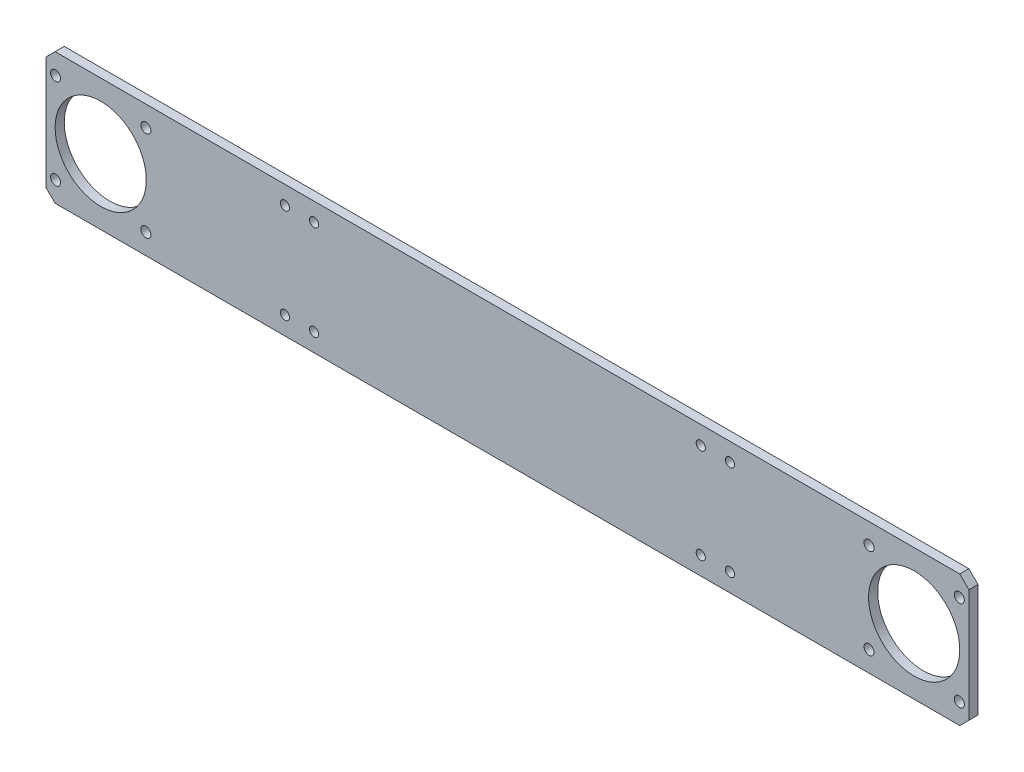
ISO-10303-21;
HEADER;
FILE_DESCRIPTION(('STEP AP214'),'2;1');
FILE_NAME('part.step','',(''),(''),'','','');
FILE_SCHEMA(('AUTOMOTIVE_DESIGN { 1 0 10303 214 1 1 1 1 }'));
ENDSEC;
DATA;
#1=APPLICATION_CONTEXT('core data for automotive mechanical design processes');
#2=APPLICATION_PROTOCOL_DEFINITION('international standard','automotive_design',2000,#1);
#3=PRODUCT_CONTEXT('',#1,'mechanical');
#4=PRODUCT('Part','Part','',(#3));
#5=PRODUCT_RELATED_PRODUCT_CATEGORY('part','',(#4));
#6=PRODUCT_DEFINITION_FORMATION('','',#4);
#7=PRODUCT_DEFINITION_CONTEXT('part definition',#1,'design');
#8=PRODUCT_DEFINITION('design','',#6,#7);
#9=PRODUCT_DEFINITION_SHAPE('','',#8);
#10=(LENGTH_UNIT() NAMED_UNIT(*) SI_UNIT(.MILLI.,.METRE.));
#11=(NAMED_UNIT(*) PLANE_ANGLE_UNIT() SI_UNIT($,.RADIAN.));
#12=(NAMED_UNIT(*) SI_UNIT($,.STERADIAN.) SOLID_ANGLE_UNIT());
#13=UNCERTAINTY_MEASURE_WITH_UNIT(LENGTH_MEASURE(1.E-05),#10,'distance_accuracy_value','');
#14=(GEOMETRIC_REPRESENTATION_CONTEXT(3) GLOBAL_UNCERTAINTY_ASSIGNED_CONTEXT((#13)) GLOBAL_UNIT_ASSIGNED_CONTEXT((#10,
#11,#12)) REPRESENTATION_CONTEXT('',''));
#15=CARTESIAN_POINT('',(0.,0.,0.));
#16=DIRECTION('',(0.,0.,1.));
#17=DIRECTION('',(1.,0.,0.));
#18=AXIS2_PLACEMENT_3D('',#15,#16,#17);
#19=CARTESIAN_POINT('',(0.,0.,5.));
#20=DIRECTION('',(0.,0.,-1.));
#21=DIRECTION('',(-1.,0.,0.));
#22=AXIS2_PLACEMENT_3D('',#19,#20,#21);
#23=PLANE('',#22);
#24=CARTESIAN_POINT('',(106.,-26.,5.));
#25=DIRECTION('',(0.,0.,1.));
#26=DIRECTION('',(-1.,0.,0.));
#27=AXIS2_PLACEMENT_3D('',#24,#25,#26);
#28=CIRCLE('',#27,2.50000000000001);
#29=CARTESIAN_POINT('',(103.5,-26.,5.));
#30=VERTEX_POINT('',#29);
#31=EDGE_CURVE('E265',#30,#30,#28,.T.);
#32=ORIENTED_EDGE('',*,*,#31,.F.);
#33=EDGE_LOOP('',(#32));
#34=FACE_BOUND('',#33,.T.);
#35=CARTESIAN_POINT('',(-106.,-26.,5.));
#36=DIRECTION('',(0.,0.,1.));
#37=DIRECTION('',(1.,0.,0.));
#38=AXIS2_PLACEMENT_3D('',#35,#36,#37);
#39=CIRCLE('',#38,2.50000000000001);
#40=CARTESIAN_POINT('',(-103.5,-26.,5.));
#41=VERTEX_POINT('',#40);
#42=EDGE_CURVE('E272',#41,#41,#39,.T.);
#43=ORIENTED_EDGE('',*,*,#42,.F.);
#44=EDGE_LOOP('',(#43));
#45=FACE_BOUND('',#44,.T.);
#46=CARTESIAN_POINT('',(-106.,26.,5.));
#47=DIRECTION('',(0.,0.,1.));
#48=DIRECTION('',(1.,0.,0.));
#49=AXIS2_PLACEMENT_3D('',#46,#47,#48);
#50=CIRCLE('',#49,2.50000000000001);
#51=CARTESIAN_POINT('',(-103.5,26.,5.));
#52=VERTEX_POINT('',#51);
#53=EDGE_CURVE('E253',#52,#52,#50,.T.);
#54=ORIENTED_EDGE('',*,*,#53,.F.);
#55=EDGE_LOOP('',(#54));
#56=FACE_BOUND('',#55,.T.);
#57=CARTESIAN_POINT('',(-122.,-26.,5.));
#58=DIRECTION('',(0.,0.,1.));
#59=DIRECTION('',(1.,0.,0.));
#60=AXIS2_PLACEMENT_3D('',#57,#58,#59);
#61=CIRCLE('',#60,2.50000000000001);
#62=CARTESIAN_POINT('',(-119.5,-26.,5.));
#63=VERTEX_POINT('',#62);
#64=EDGE_CURVE('E260',#63,#63,#61,.T.);
#65=ORIENTED_EDGE('',*,*,#64,.F.);
#66=EDGE_LOOP('',(#65));
#67=FACE_BOUND('',#66,.T.);
#68=CARTESIAN_POINT('',(122.,26.,5.));
#69=DIRECTION('',(0.,0.,1.));
#70=DIRECTION('',(-1.,0.,0.));
#71=AXIS2_PLACEMENT_3D('',#68,#69,#70);
#72=CIRCLE('',#71,2.5);
#73=CARTESIAN_POINT('',(119.5,26.,5.));
#74=VERTEX_POINT('',#73);
#75=EDGE_CURVE('E289',#74,#74,#72,.T.);
#76=ORIENTED_EDGE('',*,*,#75,.F.);
#77=EDGE_LOOP('',(#76));
#78=FACE_BOUND('',#77,.T.);
#79=CARTESIAN_POINT('',(122.,-26.,5.));
#80=DIRECTION('',(0.,0.,1.));
#81=DIRECTION('',(-1.,0.,0.));
#82=AXIS2_PLACEMENT_3D('',#79,#80,#81);
#83=CIRCLE('',#82,2.50000000000001);
#84=CARTESIAN_POINT('',(119.5,-26.,5.));
#85=VERTEX_POINT('',#84);
#86=EDGE_CURVE('E277',#85,#85,#83,.T.);
#87=ORIENTED_EDGE('',*,*,#86,.F.);
#88=EDGE_LOOP('',(#87));
#89=FACE_BOUND('',#88,.T.);
#90=CARTESIAN_POINT('',(106.,26.,5.));
#91=DIRECTION('',(0.,0.,1.));
#92=DIRECTION('',(-1.,0.,0.));
#93=AXIS2_PLACEMENT_3D('',#90,#91,#92);
#94=CIRCLE('',#93,2.50000000000001);
#95=CARTESIAN_POINT('',(103.5,26.,5.));
#96=VERTEX_POINT('',#95);
#97=EDGE_CURVE('E284',#96,#96,#94,.T.);
#98=ORIENTED_EDGE('',*,*,#97,.F.);
#99=EDGE_LOOP('',(#98));
#100=FACE_BOUND('',#99,.T.);
#101=CARTESIAN_POINT('',(-122.,26.,5.));
#102=DIRECTION('',(0.,0.,1.));
#103=DIRECTION('',(1.,0.,0.));
#104=AXIS2_PLACEMENT_3D('',#101,#102,#103);
#105=CIRCLE('',#104,2.50000000000001);
#106=CARTESIAN_POINT('',(-119.5,26.,5.));
#107=VERTEX_POINT('',#106);
#108=EDGE_CURVE('E247',#107,#107,#105,.T.);
#109=ORIENTED_EDGE('',*,*,#108,.F.);
#110=EDGE_LOOP('',(#109));
#111=FACE_BOUND('',#110,.T.);
#112=DIRECTION('',(0.,-1.,0.));
#113=VECTOR('',#112,1.);
#114=CARTESIAN_POINT('',(-253.,36.0000000000001,5.));
#115=LINE('',#114,#113);
#116=CARTESIAN_POINT('',(-253.,31.0000000000001,5.));
#117=VERTEX_POINT('',#116);
#118=CARTESIAN_POINT('',(-253.,-30.9999999999999,5.));
#119=VERTEX_POINT('',#118);
#120=EDGE_CURVE('E144',#117,#119,#115,.T.);
#121=ORIENTED_EDGE('',*,*,#120,.T.);
#122=DIRECTION('',(-0.707106781186548,0.707106781186548,0.));
#123=VECTOR('',#122,1.);
#124=CARTESIAN_POINT('',(-248.,-35.9999999999999,5.));
#125=LINE('',#124,#123);
#126=CARTESIAN_POINT('',(-248.,-35.9999999999999,5.));
#127=VERTEX_POINT('',#126);
#128=EDGE_CURVE('E158',#119,#127,#125,.F.);
#129=ORIENTED_EDGE('',*,*,#128,.T.);
#130=DIRECTION('',(1.,0.,0.));
#131=VECTOR('',#130,1.);
#132=CARTESIAN_POINT('',(253.,-35.9999999999999,5.));
#133=LINE('',#132,#131);
#134=CARTESIAN_POINT('',(248.,-35.9999999999999,5.));
#135=VERTEX_POINT('',#134);
#136=EDGE_CURVE('E125',#127,#135,#133,.T.);
#137=ORIENTED_EDGE('',*,*,#136,.T.);
#138=DIRECTION('',(-0.707106781186548,-0.707106781186548,0.));
#139=VECTOR('',#138,1.);
#140=CARTESIAN_POINT('',(253.,-30.9999999999998,5.));
#141=LINE('',#140,#139);
#142=CARTESIAN_POINT('',(253.,-30.9999999999998,5.));
#143=VERTEX_POINT('',#142);
#144=EDGE_CURVE('E154',#135,#143,#141,.F.);
#145=ORIENTED_EDGE('',*,*,#144,.T.);
#146=DIRECTION('',(0.,1.,0.));
#147=VECTOR('',#146,1.);
#148=CARTESIAN_POINT('',(253.,36.0000000000001,5.));
#149=LINE('',#148,#147);
#150=CARTESIAN_POINT('',(253.,31.0000000000001,5.));
#151=VERTEX_POINT('',#150);
#152=EDGE_CURVE('E167',#143,#151,#149,.T.);
#153=ORIENTED_EDGE('',*,*,#152,.T.);
#154=DIRECTION('',(0.707106781186548,-0.707106781186548,0.));
#155=VECTOR('',#154,1.);
#156=CARTESIAN_POINT('',(248.,36.0000000000001,5.));
#157=LINE('',#156,#155);
#158=CARTESIAN_POINT('',(248.,36.0000000000001,5.));
#159=VERTEX_POINT('',#158);
#160=EDGE_CURVE('E60',#151,#159,#157,.F.);
#161=ORIENTED_EDGE('',*,*,#160,.T.);
#162=DIRECTION('',(-1.,0.,0.));
#163=VECTOR('',#162,1.);
#164=CARTESIAN_POINT('',(253.,36.0000000000001,5.));
#165=LINE('',#164,#163);
#166=CARTESIAN_POINT('',(-248.,36.0000000000001,5.));
#167=VERTEX_POINT('',#166);
#168=EDGE_CURVE('E145',#159,#167,#165,.T.);
#169=ORIENTED_EDGE('',*,*,#168,.T.);
#170=DIRECTION('',(0.707106781186551,0.707106781186544,0.));
#171=VECTOR('',#170,1.);
#172=CARTESIAN_POINT('',(-253.,31.0000000000001,5.));
#173=LINE('',#172,#171);
#174=EDGE_CURVE('E156',#167,#117,#173,.F.);
#175=ORIENTED_EDGE('',*,*,#174,.T.);
#176=EDGE_LOOP('',(#121,#129,#137,#145,#153,#161,#169,#175));
#177=FACE_BOUND('',#176,.T.);
#178=CARTESIAN_POINT('',(223.,1.1485678381606E-13,5.));
#179=DIRECTION('',(0.,0.,1.));
#180=DIRECTION('',(1.,0.,0.));
#181=AXIS2_PLACEMENT_3D('',#178,#179,#180);
#182=CIRCLE('',#181,25.);
#183=CARTESIAN_POINT('',(248.,1.1485678381606E-13,5.));
#184=VERTEX_POINT('',#183);
#185=EDGE_CURVE('E139',#184,#184,#182,.T.);
#186=ORIENTED_EDGE('',*,*,#185,.F.);
#187=EDGE_LOOP('',(#186));
#188=FACE_BOUND('',#187,.T.);
#189=CARTESIAN_POINT('',(247.748737341529,24.7487373415293,5.));
#190=DIRECTION('',(0.,0.,1.));
#191=DIRECTION('',(1.,0.,0.));
#192=AXIS2_PLACEMENT_3D('',#189,#190,#191);
#193=CIRCLE('',#192,2.75000000000007);
#194=CARTESIAN_POINT('',(250.498737341529,24.7487373415293,5.));
#195=VERTEX_POINT('',#194);
#196=EDGE_CURVE('E190',#195,#195,#193,.T.);
#197=ORIENTED_EDGE('',*,*,#196,.F.);
#198=EDGE_LOOP('',(#197));
#199=FACE_BOUND('',#198,.T.);
#200=CARTESIAN_POINT('',(198.251262658471,24.7487373415293,5.));
#201=DIRECTION('',(0.,0.,1.));
#202=DIRECTION('',(1.,0.,0.));
#203=AXIS2_PLACEMENT_3D('',#200,#201,#202);
#204=CIRCLE('',#203,2.75000000000001);
#205=CARTESIAN_POINT('',(201.001262658471,24.7487373415293,5.));
#206=VERTEX_POINT('',#205);
#207=EDGE_CURVE('E196',#206,#206,#204,.T.);
#208=ORIENTED_EDGE('',*,*,#207,.F.);
#209=EDGE_LOOP('',(#208));
#210=FACE_BOUND('',#209,.T.);
#211=CARTESIAN_POINT('',(198.251262658471,-24.7487373415291,5.));
#212=DIRECTION('',(0.,0.,1.));
#213=DIRECTION('',(1.,0.,0.));
#214=AXIS2_PLACEMENT_3D('',#211,#212,#213);
#215=CIRCLE('',#214,2.75000000000001);
#216=CARTESIAN_POINT('',(201.001262658471,-24.7487373415291,5.));
#217=VERTEX_POINT('',#216);
#218=EDGE_CURVE('E202',#217,#217,#215,.T.);
#219=ORIENTED_EDGE('',*,*,#218,.F.);
#220=EDGE_LOOP('',(#219));
#221=FACE_BOUND('',#220,.T.);
#222=CARTESIAN_POINT('',(247.748737341529,-24.7487373415293,5.));
#223=DIRECTION('',(0.,0.,1.));
#224=DIRECTION('',(1.,0.,0.));
#225=AXIS2_PLACEMENT_3D('',#222,#223,#224);
#226=CIRCLE('',#225,2.75000000000007);
#227=CARTESIAN_POINT('',(250.498737341529,-24.7487373415293,5.));
#228=VERTEX_POINT('',#227);
#229=EDGE_CURVE('E208',#228,#228,#226,.T.);
#230=ORIENTED_EDGE('',*,*,#229,.F.);
#231=EDGE_LOOP('',(#230));
#232=FACE_BOUND('',#231,.T.);
#233=CARTESIAN_POINT('',(-247.748737341529,-24.7487373415293,5.));
#234=DIRECTION('',(0.,0.,1.));
#235=DIRECTION('',(-1.,0.,0.));
#236=AXIS2_PLACEMENT_3D('',#233,#234,#235);
#237=CIRCLE('',#236,2.75000000000004);
#238=CARTESIAN_POINT('',(-250.498737341529,-24.7487373415293,5.));
#239=VERTEX_POINT('',#238);
#240=EDGE_CURVE('E214',#239,#239,#237,.T.);
#241=ORIENTED_EDGE('',*,*,#240,.F.);
#242=EDGE_LOOP('',(#241));
#243=FACE_BOUND('',#242,.T.);
#244=CARTESIAN_POINT('',(-247.748737341529,24.7487373415293,5.));
#245=DIRECTION('',(0.,0.,1.));
#246=DIRECTION('',(-1.,0.,0.));
#247=AXIS2_PLACEMENT_3D('',#244,#245,#246);
#248=CIRCLE('',#247,2.75000000000004);
#249=CARTESIAN_POINT('',(-250.498737341529,24.7487373415293,5.));
#250=VERTEX_POINT('',#249);
#251=EDGE_CURVE('E220',#250,#250,#248,.T.);
#252=ORIENTED_EDGE('',*,*,#251,.F.);
#253=EDGE_LOOP('',(#252));
#254=FACE_BOUND('',#253,.T.);
#255=CARTESIAN_POINT('',(-198.251262658471,24.7487373415293,5.));
#256=DIRECTION('',(0.,0.,1.));
#257=DIRECTION('',(-1.,0.,0.));
#258=AXIS2_PLACEMENT_3D('',#255,#256,#257);
#259=CIRCLE('',#258,2.75000000000001);
#260=CARTESIAN_POINT('',(-201.001262658471,24.7487373415293,5.));
#261=VERTEX_POINT('',#260);
#262=EDGE_CURVE('E226',#261,#261,#259,.T.);
#263=ORIENTED_EDGE('',*,*,#262,.F.);
#264=EDGE_LOOP('',(#263));
#265=FACE_BOUND('',#264,.T.);
#266=CARTESIAN_POINT('',(-198.251262658471,-24.7487373415291,5.));
#267=DIRECTION('',(0.,0.,1.));
#268=DIRECTION('',(-1.,0.,0.));
#269=AXIS2_PLACEMENT_3D('',#266,#267,#268);
#270=CIRCLE('',#269,2.75000000000001);
#271=CARTESIAN_POINT('',(-201.001262658471,-24.7487373415291,5.));
#272=VERTEX_POINT('',#271);
#273=EDGE_CURVE('E232',#272,#272,#270,.T.);
#274=ORIENTED_EDGE('',*,*,#273,.F.);
#275=EDGE_LOOP('',(#274));
#276=FACE_BOUND('',#275,.T.);
#277=CARTESIAN_POINT('',(-223.,1.14854593410544E-13,5.));
#278=DIRECTION('',(0.,0.,1.));
#279=DIRECTION('',(-1.,0.,0.));
#280=AXIS2_PLACEMENT_3D('',#277,#278,#279);
#281=CIRCLE('',#280,25.);
#282=CARTESIAN_POINT('',(-248.,1.14854593410544E-13,5.));
#283=VERTEX_POINT('',#282);
#284=EDGE_CURVE('E238',#283,#283,#281,.T.);
#285=ORIENTED_EDGE('',*,*,#284,.F.);
#286=EDGE_LOOP('',(#285));
#287=FACE_BOUND('',#286,.T.);
#288=ADVANCED_FACE('F37',(#34,#45,#56,#67,#78,#89,#100,#111,#177,#188,#199,#210,#221,#232,#243,
#254,#265,#276,#287),#23,.F.);
#289=CARTESIAN_POINT('',(0.,0.,0.));
#290=DIRECTION('',(0.,0.,-1.));
#291=DIRECTION('',(-1.,0.,0.));
#292=AXIS2_PLACEMENT_3D('',#289,#290,#291);
#293=PLANE('',#292);
#294=CARTESIAN_POINT('',(106.,-26.,0.));
#295=DIRECTION('',(0.,0.,1.));
#296=DIRECTION('',(-1.,0.,0.));
#297=AXIS2_PLACEMENT_3D('',#294,#295,#296);
#298=CIRCLE('',#297,2.50000000000001);
#299=CARTESIAN_POINT('',(103.5,-26.,0.));
#300=VERTEX_POINT('',#299);
#301=EDGE_CURVE('E268',#300,#300,#298,.T.);
#302=ORIENTED_EDGE('',*,*,#301,.T.);
#303=EDGE_LOOP('',(#302));
#304=FACE_BOUND('',#303,.T.);
#305=CARTESIAN_POINT('',(-106.,-26.,0.));
#306=DIRECTION('',(0.,0.,1.));
#307=DIRECTION('',(1.,0.,0.));
#308=AXIS2_PLACEMENT_3D('',#305,#306,#307);
#309=CIRCLE('',#308,2.50000000000001);
#310=CARTESIAN_POINT('',(-103.5,-26.,0.));
#311=VERTEX_POINT('',#310);
#312=EDGE_CURVE('E257',#311,#311,#309,.T.);
#313=ORIENTED_EDGE('',*,*,#312,.T.);
#314=EDGE_LOOP('',(#313));
#315=FACE_BOUND('',#314,.T.);
#316=CARTESIAN_POINT('',(-106.,26.,0.));
#317=DIRECTION('',(0.,0.,1.));
#318=DIRECTION('',(1.,0.,0.));
#319=AXIS2_PLACEMENT_3D('',#316,#317,#318);
#320=CIRCLE('',#319,2.50000000000001);
#321=CARTESIAN_POINT('',(-103.5,26.,0.));
#322=VERTEX_POINT('',#321);
#323=EDGE_CURVE('E256',#322,#322,#320,.T.);
#324=ORIENTED_EDGE('',*,*,#323,.T.);
#325=EDGE_LOOP('',(#324));
#326=FACE_BOUND('',#325,.T.);
#327=CARTESIAN_POINT('',(-122.,-26.,0.));
#328=DIRECTION('',(0.,0.,1.));
#329=DIRECTION('',(1.,0.,0.));
#330=AXIS2_PLACEMENT_3D('',#327,#328,#329);
#331=CIRCLE('',#330,2.50000000000001);
#332=CARTESIAN_POINT('',(-119.5,-26.,0.));
#333=VERTEX_POINT('',#332);
#334=EDGE_CURVE('E250',#333,#333,#331,.T.);
#335=ORIENTED_EDGE('',*,*,#334,.T.);
#336=EDGE_LOOP('',(#335));
#337=FACE_BOUND('',#336,.T.);
#338=CARTESIAN_POINT('',(122.,26.,0.));
#339=DIRECTION('',(0.,0.,1.));
#340=DIRECTION('',(-1.,0.,0.));
#341=AXIS2_PLACEMENT_3D('',#338,#339,#340);
#342=CIRCLE('',#341,2.5);
#343=CARTESIAN_POINT('',(119.5,26.,0.));
#344=VERTEX_POINT('',#343);
#345=EDGE_CURVE('E281',#344,#344,#342,.T.);
#346=ORIENTED_EDGE('',*,*,#345,.T.);
#347=EDGE_LOOP('',(#346));
#348=FACE_BOUND('',#347,.T.);
#349=CARTESIAN_POINT('',(122.,-26.,0.));
#350=DIRECTION('',(0.,0.,1.));
#351=DIRECTION('',(-1.,0.,0.));
#352=AXIS2_PLACEMENT_3D('',#349,#350,#351);
#353=CIRCLE('',#352,2.50000000000001);
#354=CARTESIAN_POINT('',(119.5,-26.,0.));
#355=VERTEX_POINT('',#354);
#356=EDGE_CURVE('E280',#355,#355,#353,.T.);
#357=ORIENTED_EDGE('',*,*,#356,.T.);
#358=EDGE_LOOP('',(#357));
#359=FACE_BOUND('',#358,.T.);
#360=CARTESIAN_POINT('',(106.,26.,0.));
#361=DIRECTION('',(0.,0.,1.));
#362=DIRECTION('',(-1.,0.,0.));
#363=AXIS2_PLACEMENT_3D('',#360,#361,#362);
#364=CIRCLE('',#363,2.50000000000001);
#365=CARTESIAN_POINT('',(103.5,26.,0.));
#366=VERTEX_POINT('',#365);
#367=EDGE_CURVE('E269',#366,#366,#364,.T.);
#368=ORIENTED_EDGE('',*,*,#367,.T.);
#369=EDGE_LOOP('',(#368));
#370=FACE_BOUND('',#369,.T.);
#371=CARTESIAN_POINT('',(-122.,26.,0.));
#372=DIRECTION('',(0.,0.,1.));
#373=DIRECTION('',(1.,0.,0.));
#374=AXIS2_PLACEMENT_3D('',#371,#372,#373);
#375=CIRCLE('',#374,2.50000000000001);
#376=CARTESIAN_POINT('',(-119.5,26.,0.));
#377=VERTEX_POINT('',#376);
#378=EDGE_CURVE('E244',#377,#377,#375,.T.);
#379=ORIENTED_EDGE('',*,*,#378,.T.);
#380=EDGE_LOOP('',(#379));
#381=FACE_BOUND('',#380,.T.);
#382=CARTESIAN_POINT('',(-198.251262658471,-24.7487373415291,0.));
#383=DIRECTION('',(0.,0.,1.));
#384=DIRECTION('',(-1.,0.,0.));
#385=AXIS2_PLACEMENT_3D('',#382,#383,#384);
#386=CIRCLE('',#385,2.75000000000001);
#387=CARTESIAN_POINT('',(-201.001262658471,-24.7487373415291,0.));
#388=VERTEX_POINT('',#387);
#389=EDGE_CURVE('E235',#388,#388,#386,.T.);
#390=ORIENTED_EDGE('',*,*,#389,.T.);
#391=EDGE_LOOP('',(#390));
#392=FACE_BOUND('',#391,.T.);
#393=CARTESIAN_POINT('',(-247.748737341529,24.7487373415293,0.));
#394=DIRECTION('',(0.,0.,1.));
#395=DIRECTION('',(-1.,0.,0.));
#396=AXIS2_PLACEMENT_3D('',#393,#394,#395);
#397=CIRCLE('',#396,2.75000000000004);
#398=CARTESIAN_POINT('',(-250.498737341529,24.7487373415293,0.));
#399=VERTEX_POINT('',#398);
#400=EDGE_CURVE('E223',#399,#399,#397,.T.);
#401=ORIENTED_EDGE('',*,*,#400,.T.);
#402=EDGE_LOOP('',(#401));
#403=FACE_BOUND('',#402,.T.);
#404=CARTESIAN_POINT('',(247.748737341529,-24.7487373415293,0.));
#405=DIRECTION('',(0.,0.,1.));
#406=DIRECTION('',(1.,0.,0.));
#407=AXIS2_PLACEMENT_3D('',#404,#405,#406);
#408=CIRCLE('',#407,2.75000000000007);
#409=CARTESIAN_POINT('',(250.498737341529,-24.7487373415293,0.));
#410=VERTEX_POINT('',#409);
#411=EDGE_CURVE('E211',#410,#410,#408,.T.);
#412=ORIENTED_EDGE('',*,*,#411,.T.);
#413=EDGE_LOOP('',(#412));
#414=FACE_BOUND('',#413,.T.);
#415=CARTESIAN_POINT('',(198.251262658471,24.7487373415293,0.));
#416=DIRECTION('',(0.,0.,1.));
#417=DIRECTION('',(1.,0.,0.));
#418=AXIS2_PLACEMENT_3D('',#415,#416,#417);
#419=CIRCLE('',#418,2.75000000000001);
#420=CARTESIAN_POINT('',(201.001262658471,24.7487373415293,0.));
#421=VERTEX_POINT('',#420);
#422=EDGE_CURVE('E199',#421,#421,#419,.T.);
#423=ORIENTED_EDGE('',*,*,#422,.T.);
#424=EDGE_LOOP('',(#423));
#425=FACE_BOUND('',#424,.T.);
#426=CARTESIAN_POINT('',(223.,1.1485678381606E-13,0.));
#427=DIRECTION('',(0.,0.,1.));
#428=DIRECTION('',(1.,0.,0.));
#429=AXIS2_PLACEMENT_3D('',#426,#427,#428);
#430=CIRCLE('',#429,25.);
#431=CARTESIAN_POINT('',(248.,1.1485678381606E-13,0.));
#432=VERTEX_POINT('',#431);
#433=EDGE_CURVE('E187',#432,#432,#430,.T.);
#434=ORIENTED_EDGE('',*,*,#433,.T.);
#435=EDGE_LOOP('',(#434));
#436=FACE_BOUND('',#435,.T.);
#437=DIRECTION('',(1.,0.,0.));
#438=VECTOR('',#437,1.);
#439=CARTESIAN_POINT('',(253.,-35.9999999999999,0.));
#440=LINE('',#439,#438);
#441=CARTESIAN_POINT('',(-248.,-35.9999999999999,0.));
#442=VERTEX_POINT('',#441);
#443=CARTESIAN_POINT('',(248.,-35.9999999999999,0.));
#444=VERTEX_POINT('',#443);
#445=EDGE_CURVE('E122',#442,#444,#440,.T.);
#446=ORIENTED_EDGE('',*,*,#445,.F.);
#447=DIRECTION('',(0.707106781186548,-0.707106781186548,0.));
#448=VECTOR('',#447,1.);
#449=CARTESIAN_POINT('',(-142.,-142.,0.));
#450=LINE('',#449,#448);
#451=CARTESIAN_POINT('',(-253.,-30.9999999999999,0.));
#452=VERTEX_POINT('',#451);
#453=EDGE_CURVE('E105',#442,#452,#450,.F.);
#454=ORIENTED_EDGE('',*,*,#453,.T.);
#455=DIRECTION('',(0.,-1.,0.));
#456=VECTOR('',#455,1.);
#457=CARTESIAN_POINT('',(-253.,36.0000000000001,0.));
#458=LINE('',#457,#456);
#459=CARTESIAN_POINT('',(-253.,31.0000000000001,0.));
#460=VERTEX_POINT('',#459);
#461=EDGE_CURVE('E134',#460,#452,#458,.T.);
#462=ORIENTED_EDGE('',*,*,#461,.F.);
#463=DIRECTION('',(-0.707106781186551,-0.707106781186544,0.));
#464=VECTOR('',#463,1.);
#465=CARTESIAN_POINT('',(-141.999999999999,142.,0.));
#466=LINE('',#465,#464);
#467=CARTESIAN_POINT('',(-248.,36.0000000000001,0.));
#468=VERTEX_POINT('',#467);
#469=EDGE_CURVE('E116',#460,#468,#466,.F.);
#470=ORIENTED_EDGE('',*,*,#469,.T.);
#471=DIRECTION('',(-1.,0.,0.));
#472=VECTOR('',#471,1.);
#473=CARTESIAN_POINT('',(253.,36.0000000000001,0.));
#474=LINE('',#473,#472);
#475=CARTESIAN_POINT('',(248.,36.0000000000001,0.));
#476=VERTEX_POINT('',#475);
#477=EDGE_CURVE('E137',#476,#468,#474,.T.);
#478=ORIENTED_EDGE('',*,*,#477,.F.);
#479=DIRECTION('',(-0.707106781186548,0.707106781186548,0.));
#480=VECTOR('',#479,1.);
#481=CARTESIAN_POINT('',(142.,142.,0.));
#482=LINE('',#481,#480);
#483=CARTESIAN_POINT('',(253.,31.0000000000001,0.));
#484=VERTEX_POINT('',#483);
#485=EDGE_CURVE('E126',#476,#484,#482,.F.);
#486=ORIENTED_EDGE('',*,*,#485,.T.);
#487=DIRECTION('',(0.,1.,0.));
#488=VECTOR('',#487,1.);
#489=CARTESIAN_POINT('',(253.,36.0000000000001,0.));
#490=LINE('',#489,#488);
#491=CARTESIAN_POINT('',(253.,-30.9999999999998,0.));
#492=VERTEX_POINT('',#491);
#493=EDGE_CURVE('E133',#492,#484,#490,.T.);
#494=ORIENTED_EDGE('',*,*,#493,.F.);
#495=DIRECTION('',(0.707106781186548,0.707106781186548,0.));
#496=VECTOR('',#495,1.);
#497=CARTESIAN_POINT('',(142.,-142.,0.));
#498=LINE('',#497,#496);
#499=EDGE_CURVE('E132',#492,#444,#498,.F.);
#500=ORIENTED_EDGE('',*,*,#499,.T.);
#501=EDGE_LOOP('',(#446,#454,#462,#470,#478,#486,#494,#500));
#502=FACE_BOUND('',#501,.T.);
#503=CARTESIAN_POINT('',(247.748737341529,24.7487373415293,0.));
#504=DIRECTION('',(0.,0.,1.));
#505=DIRECTION('',(1.,0.,0.));
#506=AXIS2_PLACEMENT_3D('',#503,#504,#505);
#507=CIRCLE('',#506,2.75000000000007);
#508=CARTESIAN_POINT('',(250.498737341529,24.7487373415293,0.));
#509=VERTEX_POINT('',#508);
#510=EDGE_CURVE('E193',#509,#509,#507,.T.);
#511=ORIENTED_EDGE('',*,*,#510,.T.);
#512=EDGE_LOOP('',(#511));
#513=FACE_BOUND('',#512,.T.);
#514=CARTESIAN_POINT('',(198.251262658471,-24.7487373415291,0.));
#515=DIRECTION('',(0.,0.,1.));
#516=DIRECTION('',(1.,0.,0.));
#517=AXIS2_PLACEMENT_3D('',#514,#515,#516);
#518=CIRCLE('',#517,2.75000000000001);
#519=CARTESIAN_POINT('',(201.001262658471,-24.7487373415291,0.));
#520=VERTEX_POINT('',#519);
#521=EDGE_CURVE('E205',#520,#520,#518,.T.);
#522=ORIENTED_EDGE('',*,*,#521,.T.);
#523=EDGE_LOOP('',(#522));
#524=FACE_BOUND('',#523,.T.);
#525=CARTESIAN_POINT('',(-247.748737341529,-24.7487373415293,0.));
#526=DIRECTION('',(0.,0.,1.));
#527=DIRECTION('',(-1.,0.,0.));
#528=AXIS2_PLACEMENT_3D('',#525,#526,#527);
#529=CIRCLE('',#528,2.75000000000004);
#530=CARTESIAN_POINT('',(-250.498737341529,-24.7487373415293,0.));
#531=VERTEX_POINT('',#530);
#532=EDGE_CURVE('E217',#531,#531,#529,.T.);
#533=ORIENTED_EDGE('',*,*,#532,.T.);
#534=EDGE_LOOP('',(#533));
#535=FACE_BOUND('',#534,.T.);
#536=CARTESIAN_POINT('',(-198.251262658471,24.7487373415293,0.));
#537=DIRECTION('',(0.,0.,1.));
#538=DIRECTION('',(-1.,0.,0.));
#539=AXIS2_PLACEMENT_3D('',#536,#537,#538);
#540=CIRCLE('',#539,2.75000000000001);
#541=CARTESIAN_POINT('',(-201.001262658471,24.7487373415293,0.));
#542=VERTEX_POINT('',#541);
#543=EDGE_CURVE('E229',#542,#542,#540,.T.);
#544=ORIENTED_EDGE('',*,*,#543,.T.);
#545=EDGE_LOOP('',(#544));
#546=FACE_BOUND('',#545,.T.);
#547=CARTESIAN_POINT('',(-223.,1.14854593410544E-13,0.));
#548=DIRECTION('',(0.,0.,1.));
#549=DIRECTION('',(-1.,0.,0.));
#550=AXIS2_PLACEMENT_3D('',#547,#548,#549);
#551=CIRCLE('',#550,25.);
#552=CARTESIAN_POINT('',(-248.,1.14854593410544E-13,0.));
#553=VERTEX_POINT('',#552);
#554=EDGE_CURVE('E241',#553,#553,#551,.T.);
#555=ORIENTED_EDGE('',*,*,#554,.T.);
#556=EDGE_LOOP('',(#555));
#557=FACE_BOUND('',#556,.T.);
#558=ADVANCED_FACE('F129',(#304,#315,#326,#337,#348,#359,#370,#381,#392,#403,#414,#425,#436,
#502,#513,#524,#535,#546,#557),#293,.T.);
#559=CARTESIAN_POINT('',(-253.,36.0000000000001,5.));
#560=DIRECTION('',(1.,0.,0.));
#561=DIRECTION('',(0.,0.,-1.));
#562=AXIS2_PLACEMENT_3D('',#559,#560,#561);
#563=PLANE('',#562);
#564=ORIENTED_EDGE('',*,*,#461,.T.);
#565=DIRECTION('',(0.,0.,1.));
#566=VECTOR('',#565,1.);
#567=CARTESIAN_POINT('',(-253.,-30.9999999999999,5.));
#568=LINE('',#567,#566);
#569=EDGE_CURVE('E110',#452,#119,#568,.T.);
#570=ORIENTED_EDGE('',*,*,#569,.T.);
#571=ORIENTED_EDGE('',*,*,#120,.F.);
#572=DIRECTION('',(0.,0.,-1.));
#573=VECTOR('',#572,1.);
#574=CARTESIAN_POINT('',(-253.,31.0000000000001,5.));
#575=LINE('',#574,#573);
#576=EDGE_CURVE('E115',#117,#460,#575,.T.);
#577=ORIENTED_EDGE('',*,*,#576,.T.);
#578=EDGE_LOOP('',(#564,#570,#571,#577));
#579=FACE_BOUND('',#578,.T.);
#580=ADVANCED_FACE('F183',(#579),#563,.F.);
#581=CARTESIAN_POINT('',(253.,-35.9999999999999,5.));
#582=DIRECTION('',(0.,1.,0.));
#583=DIRECTION('',(0.,0.,1.));
#584=AXIS2_PLACEMENT_3D('',#581,#582,#583);
#585=PLANE('',#584);
#586=ORIENTED_EDGE('',*,*,#136,.F.);
#587=DIRECTION('',(0.,0.,-1.));
#588=VECTOR('',#587,1.);
#589=CARTESIAN_POINT('',(-248.,-35.9999999999999,5.));
#590=LINE('',#589,#588);
#591=EDGE_CURVE('E109',#127,#442,#590,.T.);
#592=ORIENTED_EDGE('',*,*,#591,.T.);
#593=ORIENTED_EDGE('',*,*,#445,.T.);
#594=DIRECTION('',(0.,0.,1.));
#595=VECTOR('',#594,1.);
#596=CARTESIAN_POINT('',(248.,-35.9999999999999,5.));
#597=LINE('',#596,#595);
#598=EDGE_CURVE('E127',#444,#135,#597,.T.);
#599=ORIENTED_EDGE('',*,*,#598,.T.);
#600=EDGE_LOOP('',(#586,#592,#593,#599));
#601=FACE_BOUND('',#600,.T.);
#602=ADVANCED_FACE('F121',(#601),#585,.F.);
#603=CARTESIAN_POINT('',(253.,36.0000000000001,5.));
#604=DIRECTION('',(-1.,0.,0.));
#605=DIRECTION('',(0.,0.,1.));
#606=AXIS2_PLACEMENT_3D('',#603,#604,#605);
#607=PLANE('',#606);
#608=ORIENTED_EDGE('',*,*,#152,.F.);
#609=DIRECTION('',(0.,0.,-1.));
#610=VECTOR('',#609,1.);
#611=CARTESIAN_POINT('',(253.,-30.9999999999998,5.));
#612=LINE('',#611,#610);
#613=EDGE_CURVE('E11',#143,#492,#612,.T.);
#614=ORIENTED_EDGE('',*,*,#613,.T.);
#615=ORIENTED_EDGE('',*,*,#493,.T.);
#616=DIRECTION('',(0.,0.,1.));
#617=VECTOR('',#616,1.);
#618=CARTESIAN_POINT('',(253.,31.0000000000001,5.));
#619=LINE('',#618,#617);
#620=EDGE_CURVE('E46',#484,#151,#619,.T.);
#621=ORIENTED_EDGE('',*,*,#620,.T.);
#622=EDGE_LOOP('',(#608,#614,#615,#621));
#623=FACE_BOUND('',#622,.T.);
#624=ADVANCED_FACE('F166',(#623),#607,.F.);
#625=CARTESIAN_POINT('',(253.,36.0000000000001,5.));
#626=DIRECTION('',(0.,-1.,0.));
#627=DIRECTION('',(0.,0.,-1.));
#628=AXIS2_PLACEMENT_3D('',#625,#626,#627);
#629=PLANE('',#628);
#630=ORIENTED_EDGE('',*,*,#477,.T.);
#631=DIRECTION('',(0.,0.,1.));
#632=VECTOR('',#631,1.);
#633=CARTESIAN_POINT('',(-248.,36.0000000000001,5.));
#634=LINE('',#633,#632);
#635=EDGE_CURVE('E53',#468,#167,#634,.T.);
#636=ORIENTED_EDGE('',*,*,#635,.T.);
#637=ORIENTED_EDGE('',*,*,#168,.F.);
#638=DIRECTION('',(0.,0.,-1.));
#639=VECTOR('',#638,1.);
#640=CARTESIAN_POINT('',(248.,36.0000000000001,5.));
#641=LINE('',#640,#639);
#642=EDGE_CURVE('E160',#159,#476,#641,.T.);
#643=ORIENTED_EDGE('',*,*,#642,.T.);
#644=EDGE_LOOP('',(#630,#636,#637,#643));
#645=FACE_BOUND('',#644,.T.);
#646=ADVANCED_FACE('F176',(#645),#629,.F.);
#647=CARTESIAN_POINT('',(223.,1.1485678381606E-13,5.));
#648=DIRECTION('',(0.,0.,-1.));
#649=DIRECTION('',(-1.,0.,0.));
#650=AXIS2_PLACEMENT_3D('',#647,#648,#649);
#651=CYLINDRICAL_SURFACE('',#650,25.);
#652=ORIENTED_EDGE('',*,*,#185,.T.);
#653=EDGE_LOOP('',(#652));
#654=FACE_BOUND('',#653,.T.);
#655=ORIENTED_EDGE('',*,*,#433,.F.);
#656=EDGE_LOOP('',(#655));
#657=FACE_BOUND('',#656,.T.);
#658=ADVANCED_FACE('F367',(#654,#657),#651,.F.);
#659=CARTESIAN_POINT('',(247.748737341529,24.7487373415293,5.));
#660=DIRECTION('',(0.,0.,-1.));
#661=DIRECTION('',(-1.,0.,0.));
#662=AXIS2_PLACEMENT_3D('',#659,#660,#661);
#663=CYLINDRICAL_SURFACE('',#662,2.75000000000007);
#664=ORIENTED_EDGE('',*,*,#196,.T.);
#665=EDGE_LOOP('',(#664));
#666=FACE_BOUND('',#665,.T.);
#667=ORIENTED_EDGE('',*,*,#510,.F.);
#668=EDGE_LOOP('',(#667));
#669=FACE_BOUND('',#668,.T.);
#670=ADVANCED_FACE('F363',(#666,#669),#663,.F.);
#671=CARTESIAN_POINT('',(198.251262658471,24.7487373415293,5.));
#672=DIRECTION('',(0.,0.,-1.));
#673=DIRECTION('',(-1.,0.,0.));
#674=AXIS2_PLACEMENT_3D('',#671,#672,#673);
#675=CYLINDRICAL_SURFACE('',#674,2.75000000000001);
#676=ORIENTED_EDGE('',*,*,#207,.T.);
#677=EDGE_LOOP('',(#676));
#678=FACE_BOUND('',#677,.T.);
#679=ORIENTED_EDGE('',*,*,#422,.F.);
#680=EDGE_LOOP('',(#679));
#681=FACE_BOUND('',#680,.T.);
#682=ADVANCED_FACE('F359',(#678,#681),#675,.F.);
#683=CARTESIAN_POINT('',(198.251262658471,-24.7487373415291,5.));
#684=DIRECTION('',(0.,0.,-1.));
#685=DIRECTION('',(-1.,0.,0.));
#686=AXIS2_PLACEMENT_3D('',#683,#684,#685);
#687=CYLINDRICAL_SURFACE('',#686,2.75000000000001);
#688=ORIENTED_EDGE('',*,*,#218,.T.);
#689=EDGE_LOOP('',(#688));
#690=FACE_BOUND('',#689,.T.);
#691=ORIENTED_EDGE('',*,*,#521,.F.);
#692=EDGE_LOOP('',(#691));
#693=FACE_BOUND('',#692,.T.);
#694=ADVANCED_FACE('F355',(#690,#693),#687,.F.);
#695=CARTESIAN_POINT('',(247.748737341529,-24.7487373415293,5.));
#696=DIRECTION('',(0.,0.,-1.));
#697=DIRECTION('',(-1.,0.,0.));
#698=AXIS2_PLACEMENT_3D('',#695,#696,#697);
#699=CYLINDRICAL_SURFACE('',#698,2.75000000000007);
#700=ORIENTED_EDGE('',*,*,#229,.T.);
#701=EDGE_LOOP('',(#700));
#702=FACE_BOUND('',#701,.T.);
#703=ORIENTED_EDGE('',*,*,#411,.F.);
#704=EDGE_LOOP('',(#703));
#705=FACE_BOUND('',#704,.T.);
#706=ADVANCED_FACE('F351',(#702,#705),#699,.F.);
#707=CARTESIAN_POINT('',(-247.748737341529,-24.7487373415293,5.));
#708=DIRECTION('',(0.,0.,-1.));
#709=DIRECTION('',(-1.,0.,0.));
#710=AXIS2_PLACEMENT_3D('',#707,#708,#709);
#711=CYLINDRICAL_SURFACE('',#710,2.75000000000004);
#712=ORIENTED_EDGE('',*,*,#240,.T.);
#713=EDGE_LOOP('',(#712));
#714=FACE_BOUND('',#713,.T.);
#715=ORIENTED_EDGE('',*,*,#532,.F.);
#716=EDGE_LOOP('',(#715));
#717=FACE_BOUND('',#716,.T.);
#718=ADVANCED_FACE('F347',(#714,#717),#711,.F.);
#719=CARTESIAN_POINT('',(-247.748737341529,24.7487373415293,5.));
#720=DIRECTION('',(0.,0.,-1.));
#721=DIRECTION('',(-1.,0.,0.));
#722=AXIS2_PLACEMENT_3D('',#719,#720,#721);
#723=CYLINDRICAL_SURFACE('',#722,2.75000000000004);
#724=ORIENTED_EDGE('',*,*,#251,.T.);
#725=EDGE_LOOP('',(#724));
#726=FACE_BOUND('',#725,.T.);
#727=ORIENTED_EDGE('',*,*,#400,.F.);
#728=EDGE_LOOP('',(#727));
#729=FACE_BOUND('',#728,.T.);
#730=ADVANCED_FACE('F343',(#726,#729),#723,.F.);
#731=CARTESIAN_POINT('',(-198.251262658471,24.7487373415293,5.));
#732=DIRECTION('',(0.,0.,-1.));
#733=DIRECTION('',(-1.,0.,0.));
#734=AXIS2_PLACEMENT_3D('',#731,#732,#733);
#735=CYLINDRICAL_SURFACE('',#734,2.75000000000001);
#736=ORIENTED_EDGE('',*,*,#262,.T.);
#737=EDGE_LOOP('',(#736));
#738=FACE_BOUND('',#737,.T.);
#739=ORIENTED_EDGE('',*,*,#543,.F.);
#740=EDGE_LOOP('',(#739));
#741=FACE_BOUND('',#740,.T.);
#742=ADVANCED_FACE('F339',(#738,#741),#735,.F.);
#743=CARTESIAN_POINT('',(-198.251262658471,-24.7487373415291,5.));
#744=DIRECTION('',(0.,0.,-1.));
#745=DIRECTION('',(-1.,0.,0.));
#746=AXIS2_PLACEMENT_3D('',#743,#744,#745);
#747=CYLINDRICAL_SURFACE('',#746,2.75000000000001);
#748=ORIENTED_EDGE('',*,*,#273,.T.);
#749=EDGE_LOOP('',(#748));
#750=FACE_BOUND('',#749,.T.);
#751=ORIENTED_EDGE('',*,*,#389,.F.);
#752=EDGE_LOOP('',(#751));
#753=FACE_BOUND('',#752,.T.);
#754=ADVANCED_FACE('F335',(#750,#753),#747,.F.);
#755=CARTESIAN_POINT('',(-223.,1.14854593410544E-13,5.));
#756=DIRECTION('',(0.,0.,-1.));
#757=DIRECTION('',(-1.,0.,0.));
#758=AXIS2_PLACEMENT_3D('',#755,#756,#757);
#759=CYLINDRICAL_SURFACE('',#758,25.);
#760=ORIENTED_EDGE('',*,*,#284,.T.);
#761=EDGE_LOOP('',(#760));
#762=FACE_BOUND('',#761,.T.);
#763=ORIENTED_EDGE('',*,*,#554,.F.);
#764=EDGE_LOOP('',(#763));
#765=FACE_BOUND('',#764,.T.);
#766=ADVANCED_FACE('F332',(#762,#765),#759,.F.);
#767=CARTESIAN_POINT('',(-248.,-35.9999999999999,5.));
#768=DIRECTION('',(0.707106781186547,0.707106781186547,0.));
#769=DIRECTION('',(0.,0.,-1.));
#770=AXIS2_PLACEMENT_3D('',#767,#768,#769);
#771=PLANE('',#770);
#772=ORIENTED_EDGE('',*,*,#128,.F.);
#773=ORIENTED_EDGE('',*,*,#569,.F.);
#774=ORIENTED_EDGE('',*,*,#453,.F.);
#775=ORIENTED_EDGE('',*,*,#591,.F.);
#776=EDGE_LOOP('',(#772,#773,#774,#775));
#777=FACE_BOUND('',#776,.T.);
#778=ADVANCED_FACE('F108',(#777),#771,.F.);
#779=CARTESIAN_POINT('',(-253.,31.0000000000001,5.));
#780=DIRECTION('',(0.707106781186544,-0.707106781186551,0.));
#781=DIRECTION('',(0.,0.,-1.));
#782=AXIS2_PLACEMENT_3D('',#779,#780,#781);
#783=PLANE('',#782);
#784=ORIENTED_EDGE('',*,*,#174,.F.);
#785=ORIENTED_EDGE('',*,*,#635,.F.);
#786=ORIENTED_EDGE('',*,*,#469,.F.);
#787=ORIENTED_EDGE('',*,*,#576,.F.);
#788=EDGE_LOOP('',(#784,#785,#786,#787));
#789=FACE_BOUND('',#788,.T.);
#790=ADVANCED_FACE('F180',(#789),#783,.F.);
#791=CARTESIAN_POINT('',(253.,-30.9999999999998,5.));
#792=DIRECTION('',(-0.707106781186547,0.707106781186547,0.));
#793=DIRECTION('',(0.,0.,-1.));
#794=AXIS2_PLACEMENT_3D('',#791,#792,#793);
#795=PLANE('',#794);
#796=ORIENTED_EDGE('',*,*,#144,.F.);
#797=ORIENTED_EDGE('',*,*,#598,.F.);
#798=ORIENTED_EDGE('',*,*,#499,.F.);
#799=ORIENTED_EDGE('',*,*,#613,.F.);
#800=EDGE_LOOP('',(#796,#797,#798,#799));
#801=FACE_BOUND('',#800,.T.);
#802=ADVANCED_FACE('F326',(#801),#795,.F.);
#803=CARTESIAN_POINT('',(248.,36.0000000000001,5.));
#804=DIRECTION('',(-0.707106781186547,-0.707106781186547,0.));
#805=DIRECTION('',(0.,0.,-1.));
#806=AXIS2_PLACEMENT_3D('',#803,#804,#805);
#807=PLANE('',#806);
#808=ORIENTED_EDGE('',*,*,#160,.F.);
#809=ORIENTED_EDGE('',*,*,#620,.F.);
#810=ORIENTED_EDGE('',*,*,#485,.F.);
#811=ORIENTED_EDGE('',*,*,#642,.F.);
#812=EDGE_LOOP('',(#808,#809,#810,#811));
#813=FACE_BOUND('',#812,.T.);
#814=ADVANCED_FACE('F40',(#813),#807,.F.);
#815=CARTESIAN_POINT('',(-122.,26.,0.));
#816=DIRECTION('',(0.,0.,1.));
#817=DIRECTION('',(1.,0.,0.));
#818=AXIS2_PLACEMENT_3D('',#815,#816,#817);
#819=CYLINDRICAL_SURFACE('',#818,2.50000000000001);
#820=ORIENTED_EDGE('',*,*,#378,.F.);
#821=EDGE_LOOP('',(#820));
#822=FACE_BOUND('',#821,.T.);
#823=ORIENTED_EDGE('',*,*,#108,.T.);
#824=EDGE_LOOP('',(#823));
#825=FACE_BOUND('',#824,.T.);
#826=ADVANCED_FACE('F315',(#822,#825),#819,.F.);
#827=CARTESIAN_POINT('',(106.,26.,0.));
#828=DIRECTION('',(0.,0.,1.));
#829=DIRECTION('',(1.,0.,0.));
#830=AXIS2_PLACEMENT_3D('',#827,#828,#829);
#831=CYLINDRICAL_SURFACE('',#830,2.50000000000001);
#832=ORIENTED_EDGE('',*,*,#367,.F.);
#833=EDGE_LOOP('',(#832));
#834=FACE_BOUND('',#833,.T.);
#835=ORIENTED_EDGE('',*,*,#97,.T.);
#836=EDGE_LOOP('',(#835));
#837=FACE_BOUND('',#836,.T.);
#838=ADVANCED_FACE('F317',(#834,#837),#831,.F.);
#839=CARTESIAN_POINT('',(122.,-26.,0.));
#840=DIRECTION('',(0.,0.,1.));
#841=DIRECTION('',(1.,0.,0.));
#842=AXIS2_PLACEMENT_3D('',#839,#840,#841);
#843=CYLINDRICAL_SURFACE('',#842,2.50000000000001);
#844=ORIENTED_EDGE('',*,*,#356,.F.);
#845=EDGE_LOOP('',(#844));
#846=FACE_BOUND('',#845,.T.);
#847=ORIENTED_EDGE('',*,*,#86,.T.);
#848=EDGE_LOOP('',(#847));
#849=FACE_BOUND('',#848,.T.);
#850=ADVANCED_FACE('F301',(#846,#849),#843,.F.);
#851=CARTESIAN_POINT('',(122.,26.,0.));
#852=DIRECTION('',(0.,0.,1.));
#853=DIRECTION('',(1.,0.,0.));
#854=AXIS2_PLACEMENT_3D('',#851,#852,#853);
#855=CYLINDRICAL_SURFACE('',#854,2.5);
#856=ORIENTED_EDGE('',*,*,#345,.F.);
#857=EDGE_LOOP('',(#856));
#858=FACE_BOUND('',#857,.T.);
#859=ORIENTED_EDGE('',*,*,#75,.T.);
#860=EDGE_LOOP('',(#859));
#861=FACE_BOUND('',#860,.T.);
#862=ADVANCED_FACE('F297',(#858,#861),#855,.F.);
#863=CARTESIAN_POINT('',(-122.,-26.,0.));
#864=DIRECTION('',(0.,0.,1.));
#865=DIRECTION('',(1.,0.,0.));
#866=AXIS2_PLACEMENT_3D('',#863,#864,#865);
#867=CYLINDRICAL_SURFACE('',#866,2.50000000000001);
#868=ORIENTED_EDGE('',*,*,#334,.F.);
#869=EDGE_LOOP('',(#868));
#870=FACE_BOUND('',#869,.T.);
#871=ORIENTED_EDGE('',*,*,#64,.T.);
#872=EDGE_LOOP('',(#871));
#873=FACE_BOUND('',#872,.T.);
#874=ADVANCED_FACE('F300',(#870,#873),#867,.F.);
#875=CARTESIAN_POINT('',(-106.,26.,0.));
#876=DIRECTION('',(0.,0.,1.));
#877=DIRECTION('',(1.,0.,0.));
#878=AXIS2_PLACEMENT_3D('',#875,#876,#877);
#879=CYLINDRICAL_SURFACE('',#878,2.50000000000001);
#880=ORIENTED_EDGE('',*,*,#323,.F.);
#881=EDGE_LOOP('',(#880));
#882=FACE_BOUND('',#881,.T.);
#883=ORIENTED_EDGE('',*,*,#53,.T.);
#884=EDGE_LOOP('',(#883));
#885=FACE_BOUND('',#884,.T.);
#886=ADVANCED_FACE('F330',(#882,#885),#879,.F.);
#887=CARTESIAN_POINT('',(-106.,-26.,0.));
#888=DIRECTION('',(0.,0.,1.));
#889=DIRECTION('',(1.,0.,0.));
#890=AXIS2_PLACEMENT_3D('',#887,#888,#889);
#891=CYLINDRICAL_SURFACE('',#890,2.50000000000001);
#892=ORIENTED_EDGE('',*,*,#312,.F.);
#893=EDGE_LOOP('',(#892));
#894=FACE_BOUND('',#893,.T.);
#895=ORIENTED_EDGE('',*,*,#42,.T.);
#896=EDGE_LOOP('',(#895));
#897=FACE_BOUND('',#896,.T.);
#898=ADVANCED_FACE('F460',(#894,#897),#891,.F.);
#899=CARTESIAN_POINT('',(106.,-26.,0.));
#900=DIRECTION('',(0.,0.,1.));
#901=DIRECTION('',(1.,0.,0.));
#902=AXIS2_PLACEMENT_3D('',#899,#900,#901);
#903=CYLINDRICAL_SURFACE('',#902,2.50000000000001);
#904=ORIENTED_EDGE('',*,*,#301,.F.);
#905=EDGE_LOOP('',(#904));
#906=FACE_BOUND('',#905,.T.);
#907=ORIENTED_EDGE('',*,*,#31,.T.);
#908=EDGE_LOOP('',(#907));
#909=FACE_BOUND('',#908,.T.);
#910=ADVANCED_FACE('F469',(#906,#909),#903,.F.);
#911=CLOSED_SHELL('',(#288,#558,#580,#602,#624,#646,#658,#670,#682,#694,#706,#718,#730,#742,
#754,#766,#778,#790,#802,#814,#826,#838,#850,#862,#874,#886,#898,#910));
#912=MANIFOLD_SOLID_BREP('B2',#911);
#913=ADVANCED_BREP_SHAPE_REPRESENTATION('',(#18,#912),#14);
#914=SHAPE_DEFINITION_REPRESENTATION(#9,#913);
ENDSEC;
END-ISO-10303-21;
